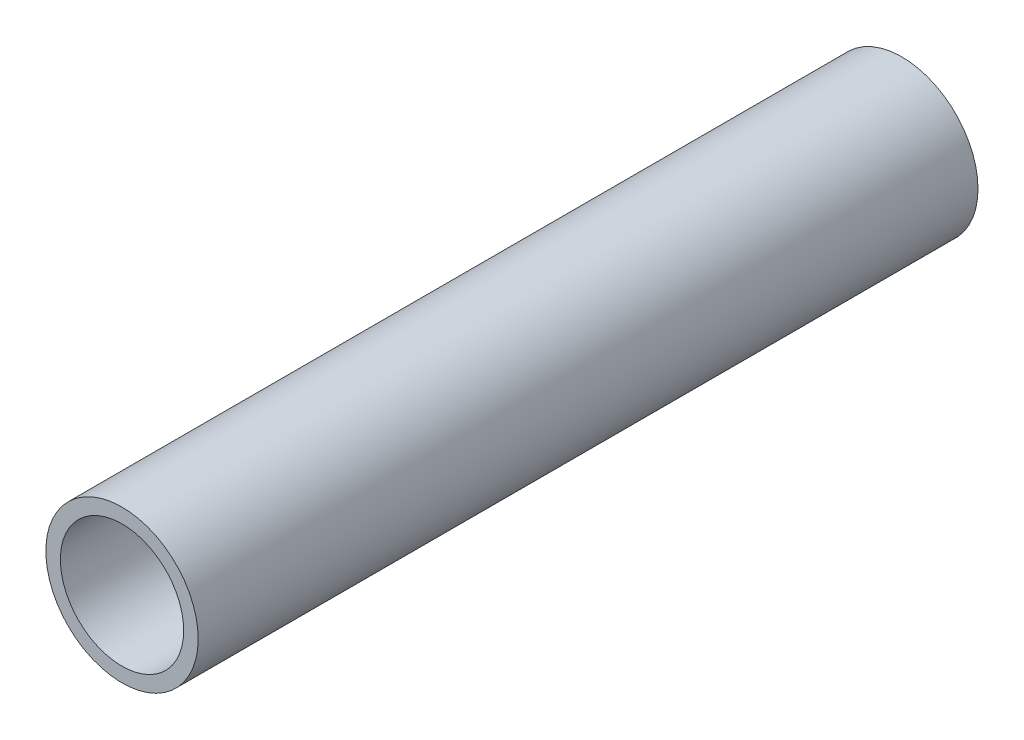
ISO-10303-21;
HEADER;
FILE_DESCRIPTION(('STEP AP214'),'2;1');
FILE_NAME('part.step','',(''),(''),'','','');
FILE_SCHEMA(('AUTOMOTIVE_DESIGN { 1 0 10303 214 1 1 1 1 }'));
ENDSEC;
DATA;
#1=APPLICATION_CONTEXT('core data for automotive mechanical design processes');
#2=APPLICATION_PROTOCOL_DEFINITION('international standard','automotive_design',2000,#1);
#3=PRODUCT_CONTEXT('',#1,'mechanical');
#4=PRODUCT('Part','Part','',(#3));
#5=PRODUCT_RELATED_PRODUCT_CATEGORY('part','',(#4));
#6=PRODUCT_DEFINITION_FORMATION('','',#4);
#7=PRODUCT_DEFINITION_CONTEXT('part definition',#1,'design');
#8=PRODUCT_DEFINITION('design','',#6,#7);
#9=PRODUCT_DEFINITION_SHAPE('','',#8);
#10=(LENGTH_UNIT() NAMED_UNIT(*) SI_UNIT(.MILLI.,.METRE.));
#11=(NAMED_UNIT(*) PLANE_ANGLE_UNIT() SI_UNIT($,.RADIAN.));
#12=(NAMED_UNIT(*) SI_UNIT($,.STERADIAN.) SOLID_ANGLE_UNIT());
#13=UNCERTAINTY_MEASURE_WITH_UNIT(LENGTH_MEASURE(1.E-05),#10,'distance_accuracy_value','');
#14=(GEOMETRIC_REPRESENTATION_CONTEXT(3) GLOBAL_UNCERTAINTY_ASSIGNED_CONTEXT((#13)) GLOBAL_UNIT_ASSIGNED_CONTEXT((#10,
#11,#12)) REPRESENTATION_CONTEXT('',''));
#15=CARTESIAN_POINT('',(0.,0.,0.));
#16=DIRECTION('',(0.,0.,1.));
#17=DIRECTION('',(1.,0.,0.));
#18=AXIS2_PLACEMENT_3D('',#15,#16,#17);
#19=CARTESIAN_POINT('',(0.,0.,215.));
#20=DIRECTION('',(0.,0.,1.));
#21=DIRECTION('',(1.,0.,0.));
#22=AXIS2_PLACEMENT_3D('',#19,#20,#21);
#23=PLANE('',#22);
#24=CARTESIAN_POINT('',(0.,0.,215.));
#25=DIRECTION('',(0.,0.,1.));
#26=DIRECTION('',(1.,0.,0.));
#27=AXIS2_PLACEMENT_3D('',#24,#25,#26);
#28=CIRCLE('',#27,21.);
#29=CARTESIAN_POINT('',(21.,0.,215.));
#30=VERTEX_POINT('',#29);
#31=EDGE_CURVE('E10',#30,#30,#28,.T.);
#32=ORIENTED_EDGE('',*,*,#31,.T.);
#33=EDGE_LOOP('',(#32));
#34=FACE_BOUND('',#33,.T.);
#35=CARTESIAN_POINT('',(0.,0.,215.));
#36=DIRECTION('',(0.,0.,1.));
#37=DIRECTION('',(1.,0.,0.));
#38=AXIS2_PLACEMENT_3D('',#35,#36,#37);
#39=CIRCLE('',#38,17.);
#40=CARTESIAN_POINT('',(17.,0.,215.));
#41=VERTEX_POINT('',#40);
#42=EDGE_CURVE('E52',#41,#41,#39,.T.);
#43=ORIENTED_EDGE('',*,*,#42,.F.);
#44=EDGE_LOOP('',(#43));
#45=FACE_BOUND('',#44,.T.);
#46=ADVANCED_FACE('F41',(#34,#45),#23,.T.);
#47=CARTESIAN_POINT('',(0.,0.,0.));
#48=DIRECTION('',(0.,0.,1.));
#49=DIRECTION('',(1.,0.,0.));
#50=AXIS2_PLACEMENT_3D('',#47,#48,#49);
#51=PLANE('',#50);
#52=CARTESIAN_POINT('',(0.,0.,0.));
#53=DIRECTION('',(0.,0.,1.));
#54=DIRECTION('',(1.,0.,0.));
#55=AXIS2_PLACEMENT_3D('',#52,#53,#54);
#56=CIRCLE('',#55,21.);
#57=CARTESIAN_POINT('',(21.,0.,0.));
#58=VERTEX_POINT('',#57);
#59=EDGE_CURVE('E45',#58,#58,#56,.T.);
#60=ORIENTED_EDGE('',*,*,#59,.F.);
#61=EDGE_LOOP('',(#60));
#62=FACE_BOUND('',#61,.T.);
#63=CARTESIAN_POINT('',(0.,0.,0.));
#64=DIRECTION('',(0.,0.,1.));
#65=DIRECTION('',(1.,0.,0.));
#66=AXIS2_PLACEMENT_3D('',#63,#64,#65);
#67=CIRCLE('',#66,17.);
#68=CARTESIAN_POINT('',(17.,0.,0.));
#69=VERTEX_POINT('',#68);
#70=EDGE_CURVE('E54',#69,#69,#67,.T.);
#71=ORIENTED_EDGE('',*,*,#70,.T.);
#72=EDGE_LOOP('',(#71));
#73=FACE_BOUND('',#72,.T.);
#74=ADVANCED_FACE('F64',(#62,#73),#51,.F.);
#75=CARTESIAN_POINT('',(0.,0.,215.));
#76=DIRECTION('',(0.,0.,-1.));
#77=DIRECTION('',(-1.,0.,0.));
#78=AXIS2_PLACEMENT_3D('',#75,#76,#77);
#79=CYLINDRICAL_SURFACE('',#78,21.);
#80=ORIENTED_EDGE('',*,*,#31,.F.);
#81=EDGE_LOOP('',(#80));
#82=FACE_BOUND('',#81,.T.);
#83=ORIENTED_EDGE('',*,*,#59,.T.);
#84=EDGE_LOOP('',(#83));
#85=FACE_BOUND('',#84,.T.);
#86=ADVANCED_FACE('F43',(#82,#85),#79,.T.);
#87=CARTESIAN_POINT('',(0.,0.,215.));
#88=DIRECTION('',(0.,0.,-1.));
#89=DIRECTION('',(-1.,0.,0.));
#90=AXIS2_PLACEMENT_3D('',#87,#88,#89);
#91=CYLINDRICAL_SURFACE('',#90,17.);
#92=ORIENTED_EDGE('',*,*,#42,.T.);
#93=EDGE_LOOP('',(#92));
#94=FACE_BOUND('',#93,.T.);
#95=ORIENTED_EDGE('',*,*,#70,.F.);
#96=EDGE_LOOP('',(#95));
#97=FACE_BOUND('',#96,.T.);
#98=ADVANCED_FACE('F60',(#94,#97),#91,.F.);
#99=CLOSED_SHELL('',(#46,#74,#86,#98));
#100=MANIFOLD_SOLID_BREP('B2',#99);
#101=ADVANCED_BREP_SHAPE_REPRESENTATION('',(#18,#100),#14);
#102=SHAPE_DEFINITION_REPRESENTATION(#9,#101);
ENDSEC;
END-ISO-10303-21;
